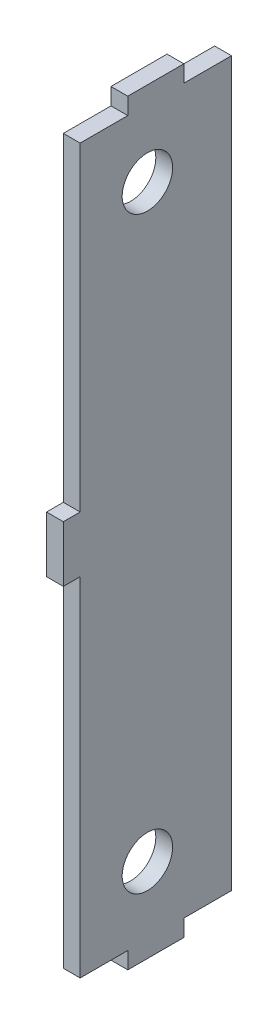
ISO-10303-21;
HEADER;
FILE_DESCRIPTION(('STEP AP214'),'2;1');
FILE_NAME('part.step','',(''),(''),'','','');
FILE_SCHEMA(('AUTOMOTIVE_DESIGN { 1 0 10303 214 1 1 1 1 }'));
ENDSEC;
DATA;
#1=APPLICATION_CONTEXT('core data for automotive mechanical design processes');
#2=APPLICATION_PROTOCOL_DEFINITION('international standard','automotive_design',2000,#1);
#3=PRODUCT_CONTEXT('',#1,'mechanical');
#4=PRODUCT('Part','Part','',(#3));
#5=PRODUCT_RELATED_PRODUCT_CATEGORY('part','',(#4));
#6=PRODUCT_DEFINITION_FORMATION('','',#4);
#7=PRODUCT_DEFINITION_CONTEXT('part definition',#1,'design');
#8=PRODUCT_DEFINITION('design','',#6,#7);
#9=PRODUCT_DEFINITION_SHAPE('','',#8);
#10=(LENGTH_UNIT() NAMED_UNIT(*) SI_UNIT(.MILLI.,.METRE.));
#11=(NAMED_UNIT(*) PLANE_ANGLE_UNIT() SI_UNIT($,.RADIAN.));
#12=(NAMED_UNIT(*) SI_UNIT($,.STERADIAN.) SOLID_ANGLE_UNIT());
#13=UNCERTAINTY_MEASURE_WITH_UNIT(LENGTH_MEASURE(1.E-05),#10,'distance_accuracy_value','');
#14=(GEOMETRIC_REPRESENTATION_CONTEXT(3) GLOBAL_UNCERTAINTY_ASSIGNED_CONTEXT((#13)) GLOBAL_UNIT_ASSIGNED_CONTEXT((#10,
#11,#12)) REPRESENTATION_CONTEXT('',''));
#15=CARTESIAN_POINT('',(0.,0.,0.));
#16=DIRECTION('',(0.,0.,1.));
#17=DIRECTION('',(1.,0.,0.));
#18=AXIS2_PLACEMENT_3D('',#15,#16,#17);
#19=CARTESIAN_POINT('',(3.,64.5,0.));
#20=DIRECTION('',(0.,0.,1.));
#21=DIRECTION('',(1.,0.,0.));
#22=AXIS2_PLACEMENT_3D('',#19,#20,#21);
#23=PLANE('',#22);
#24=DIRECTION('',(0.,1.,0.));
#25=VECTOR('',#24,1.);
#26=CARTESIAN_POINT('',(0.,64.5,0.));
#27=LINE('',#26,#25);
#28=CARTESIAN_POINT('',(0.,-64.5,0.));
#29=VERTEX_POINT('',#28);
#30=CARTESIAN_POINT('',(0.,64.5,0.));
#31=VERTEX_POINT('',#30);
#32=EDGE_CURVE('E177',#29,#31,#27,.T.);
#33=ORIENTED_EDGE('',*,*,#32,.T.);
#34=DIRECTION('',(-1.,0.,0.));
#35=VECTOR('',#34,1.);
#36=CARTESIAN_POINT('',(3.,64.5,0.));
#37=LINE('',#36,#35);
#38=CARTESIAN_POINT('',(3.,64.5,0.));
#39=VERTEX_POINT('',#38);
#40=EDGE_CURVE('E11',#39,#31,#37,.T.);
#41=ORIENTED_EDGE('',*,*,#40,.F.);
#42=DIRECTION('',(0.,1.,0.));
#43=VECTOR('',#42,1.);
#44=CARTESIAN_POINT('',(3.,64.5,0.));
#45=LINE('',#44,#43);
#46=CARTESIAN_POINT('',(3.,-64.5,0.));
#47=VERTEX_POINT('',#46);
#48=EDGE_CURVE('E208',#47,#39,#45,.T.);
#49=ORIENTED_EDGE('',*,*,#48,.F.);
#50=DIRECTION('',(-1.,0.,0.));
#51=VECTOR('',#50,1.);
#52=CARTESIAN_POINT('',(3.,-64.5,0.));
#53=LINE('',#52,#51);
#54=EDGE_CURVE('E173',#47,#29,#53,.T.);
#55=ORIENTED_EDGE('',*,*,#54,.T.);
#56=EDGE_LOOP('',(#33,#41,#49,#55));
#57=FACE_BOUND('',#56,.T.);
#58=ADVANCED_FACE('F33',(#57),#23,.F.);
#59=CARTESIAN_POINT('',(3.,64.5,0.));
#60=DIRECTION('',(0.,-1.,0.));
#61=DIRECTION('',(0.,0.,-1.));
#62=AXIS2_PLACEMENT_3D('',#59,#60,#61);
#63=PLANE('',#62);
#64=DIRECTION('',(0.,0.,1.));
#65=VECTOR('',#64,1.);
#66=CARTESIAN_POINT('',(0.,64.5,0.));
#67=LINE('',#66,#65);
#68=CARTESIAN_POINT('',(0.,64.5,8.49999999999999));
#69=VERTEX_POINT('',#68);
#70=EDGE_CURVE('E180',#31,#69,#67,.T.);
#71=ORIENTED_EDGE('',*,*,#70,.T.);
#72=DIRECTION('',(-1.,0.,0.));
#73=VECTOR('',#72,1.);
#74=CARTESIAN_POINT('',(3.,64.5,8.49999999999999));
#75=LINE('',#74,#73);
#76=CARTESIAN_POINT('',(3.,64.5,8.49999999999999));
#77=VERTEX_POINT('',#76);
#78=EDGE_CURVE('E41',#77,#69,#75,.T.);
#79=ORIENTED_EDGE('',*,*,#78,.F.);
#80=DIRECTION('',(0.,0.,1.));
#81=VECTOR('',#80,1.);
#82=CARTESIAN_POINT('',(3.,64.5,0.));
#83=LINE('',#82,#81);
#84=EDGE_CURVE('E116',#39,#77,#83,.T.);
#85=ORIENTED_EDGE('',*,*,#84,.F.);
#86=ORIENTED_EDGE('',*,*,#40,.T.);
#87=EDGE_LOOP('',(#71,#79,#85,#86));
#88=FACE_BOUND('',#87,.T.);
#89=ADVANCED_FACE('F307',(#88),#63,.F.);
#90=CARTESIAN_POINT('',(3.,64.5,8.49999999999999));
#91=DIRECTION('',(0.,0.,1.));
#92=DIRECTION('',(1.,0.,0.));
#93=AXIS2_PLACEMENT_3D('',#90,#91,#92);
#94=PLANE('',#93);
#95=DIRECTION('',(0.,1.,0.));
#96=VECTOR('',#95,1.);
#97=CARTESIAN_POINT('',(0.,64.5,8.49999999999999));
#98=LINE('',#97,#96);
#99=CARTESIAN_POINT('',(0.,67.5,8.49999999999999));
#100=VERTEX_POINT('',#99);
#101=EDGE_CURVE('E183',#69,#100,#98,.T.);
#102=ORIENTED_EDGE('',*,*,#101,.T.);
#103=DIRECTION('',(-1.,0.,0.));
#104=VECTOR('',#103,1.);
#105=CARTESIAN_POINT('',(3.,67.5,8.49999999999999));
#106=LINE('',#105,#104);
#107=CARTESIAN_POINT('',(3.,67.5,8.49999999999999));
#108=VERTEX_POINT('',#107);
#109=EDGE_CURVE('E239',#108,#100,#106,.T.);
#110=ORIENTED_EDGE('',*,*,#109,.F.);
#111=DIRECTION('',(0.,1.,0.));
#112=VECTOR('',#111,1.);
#113=CARTESIAN_POINT('',(3.,64.5,8.49999999999999));
#114=LINE('',#113,#112);
#115=EDGE_CURVE('E247',#77,#108,#114,.T.);
#116=ORIENTED_EDGE('',*,*,#115,.F.);
#117=ORIENTED_EDGE('',*,*,#78,.T.);
#118=EDGE_LOOP('',(#102,#110,#116,#117));
#119=FACE_BOUND('',#118,.T.);
#120=ADVANCED_FACE('F245',(#119),#94,.F.);
#121=CARTESIAN_POINT('',(3.,67.5,18.5));
#122=DIRECTION('',(0.,-1.,0.));
#123=DIRECTION('',(0.,0.,-1.));
#124=AXIS2_PLACEMENT_3D('',#121,#122,#123);
#125=PLANE('',#124);
#126=DIRECTION('',(0.,0.,1.));
#127=VECTOR('',#126,1.);
#128=CARTESIAN_POINT('',(0.,67.5,18.5));
#129=LINE('',#128,#127);
#130=CARTESIAN_POINT('',(0.,67.5,18.5));
#131=VERTEX_POINT('',#130);
#132=EDGE_CURVE('E185',#100,#131,#129,.T.);
#133=ORIENTED_EDGE('',*,*,#132,.T.);
#134=DIRECTION('',(-1.,0.,0.));
#135=VECTOR('',#134,1.);
#136=CARTESIAN_POINT('',(3.,67.5,18.5));
#137=LINE('',#136,#135);
#138=CARTESIAN_POINT('',(3.,67.5,18.5));
#139=VERTEX_POINT('',#138);
#140=EDGE_CURVE('E236',#139,#131,#137,.T.);
#141=ORIENTED_EDGE('',*,*,#140,.F.);
#142=DIRECTION('',(0.,0.,1.));
#143=VECTOR('',#142,1.);
#144=CARTESIAN_POINT('',(3.,67.5,18.5));
#145=LINE('',#144,#143);
#146=EDGE_CURVE('E265',#108,#139,#145,.T.);
#147=ORIENTED_EDGE('',*,*,#146,.F.);
#148=ORIENTED_EDGE('',*,*,#109,.T.);
#149=EDGE_LOOP('',(#133,#141,#147,#148));
#150=FACE_BOUND('',#149,.T.);
#151=ADVANCED_FACE('F256',(#150),#125,.F.);
#152=CARTESIAN_POINT('',(3.,64.5,18.5));
#153=DIRECTION('',(0.,0.,-1.));
#154=DIRECTION('',(-1.,0.,0.));
#155=AXIS2_PLACEMENT_3D('',#152,#153,#154);
#156=PLANE('',#155);
#157=DIRECTION('',(0.,-1.,0.));
#158=VECTOR('',#157,1.);
#159=CARTESIAN_POINT('',(0.,64.5,18.5));
#160=LINE('',#159,#158);
#161=CARTESIAN_POINT('',(0.,64.5,18.5));
#162=VERTEX_POINT('',#161);
#163=EDGE_CURVE('E187',#131,#162,#160,.T.);
#164=ORIENTED_EDGE('',*,*,#163,.T.);
#165=DIRECTION('',(-1.,0.,0.));
#166=VECTOR('',#165,1.);
#167=CARTESIAN_POINT('',(3.,64.5,18.5));
#168=LINE('',#167,#166);
#169=CARTESIAN_POINT('',(3.,64.5,18.5));
#170=VERTEX_POINT('',#169);
#171=EDGE_CURVE('E233',#170,#162,#168,.T.);
#172=ORIENTED_EDGE('',*,*,#171,.F.);
#173=DIRECTION('',(0.,-1.,0.));
#174=VECTOR('',#173,1.);
#175=CARTESIAN_POINT('',(3.,64.5,18.5));
#176=LINE('',#175,#174);
#177=EDGE_CURVE('E262',#139,#170,#176,.T.);
#178=ORIENTED_EDGE('',*,*,#177,.F.);
#179=ORIENTED_EDGE('',*,*,#140,.T.);
#180=EDGE_LOOP('',(#164,#172,#178,#179));
#181=FACE_BOUND('',#180,.T.);
#182=ADVANCED_FACE('F260',(#181),#156,.F.);
#183=CARTESIAN_POINT('',(3.,64.5,18.5));
#184=DIRECTION('',(0.,-1.,0.));
#185=DIRECTION('',(0.,0.,-1.));
#186=AXIS2_PLACEMENT_3D('',#183,#184,#185);
#187=PLANE('',#186);
#188=DIRECTION('',(0.,0.,1.));
#189=VECTOR('',#188,1.);
#190=CARTESIAN_POINT('',(0.,64.5,18.5));
#191=LINE('',#190,#189);
#192=CARTESIAN_POINT('',(0.,64.5,27.));
#193=VERTEX_POINT('',#192);
#194=EDGE_CURVE('E189',#162,#193,#191,.T.);
#195=ORIENTED_EDGE('',*,*,#194,.T.);
#196=DIRECTION('',(-1.,0.,0.));
#197=VECTOR('',#196,1.);
#198=CARTESIAN_POINT('',(3.,64.5,27.));
#199=LINE('',#198,#197);
#200=CARTESIAN_POINT('',(3.,64.5,27.));
#201=VERTEX_POINT('',#200);
#202=EDGE_CURVE('E230',#201,#193,#199,.T.);
#203=ORIENTED_EDGE('',*,*,#202,.F.);
#204=DIRECTION('',(0.,0.,1.));
#205=VECTOR('',#204,1.);
#206=CARTESIAN_POINT('',(3.,64.5,18.5));
#207=LINE('',#206,#205);
#208=EDGE_CURVE('E264',#170,#201,#207,.T.);
#209=ORIENTED_EDGE('',*,*,#208,.F.);
#210=ORIENTED_EDGE('',*,*,#171,.T.);
#211=EDGE_LOOP('',(#195,#203,#209,#210));
#212=FACE_BOUND('',#211,.T.);
#213=ADVANCED_FACE('F320',(#212),#187,.F.);
#214=CARTESIAN_POINT('',(3.,64.5,27.));
#215=DIRECTION('',(0.,0.,-1.));
#216=DIRECTION('',(0.,1.,0.));
#217=AXIS2_PLACEMENT_3D('',#214,#215,#216);
#218=PLANE('',#217);
#219=DIRECTION('',(0.,-1.,0.));
#220=VECTOR('',#219,1.);
#221=CARTESIAN_POINT('',(0.,64.5,27.));
#222=LINE('',#221,#220);
#223=CARTESIAN_POINT('',(0.,7.5,27.));
#224=VERTEX_POINT('',#223);
#225=EDGE_CURVE('E191',#193,#224,#222,.T.);
#226=ORIENTED_EDGE('',*,*,#225,.T.);
#227=DIRECTION('',(-1.,0.,0.));
#228=VECTOR('',#227,1.);
#229=CARTESIAN_POINT('',(3.,7.5,27.));
#230=LINE('',#229,#228);
#231=CARTESIAN_POINT('',(3.,7.5,27.));
#232=VERTEX_POINT('',#231);
#233=EDGE_CURVE('E227',#232,#224,#230,.T.);
#234=ORIENTED_EDGE('',*,*,#233,.F.);
#235=DIRECTION('',(0.,-1.,0.));
#236=VECTOR('',#235,1.);
#237=CARTESIAN_POINT('',(3.,64.5,27.));
#238=LINE('',#237,#236);
#239=EDGE_CURVE('E267',#201,#232,#238,.T.);
#240=ORIENTED_EDGE('',*,*,#239,.F.);
#241=ORIENTED_EDGE('',*,*,#202,.T.);
#242=EDGE_LOOP('',(#226,#234,#240,#241));
#243=FACE_BOUND('',#242,.T.);
#244=ADVANCED_FACE('F323',(#243),#218,.F.);
#245=CARTESIAN_POINT('',(3.,7.5,27.));
#246=DIRECTION('',(0.,-1.,0.));
#247=DIRECTION('',(0.,0.,-1.));
#248=AXIS2_PLACEMENT_3D('',#245,#246,#247);
#249=PLANE('',#248);
#250=DIRECTION('',(0.,0.,1.));
#251=VECTOR('',#250,1.);
#252=CARTESIAN_POINT('',(0.,7.5,27.));
#253=LINE('',#252,#251);
#254=CARTESIAN_POINT('',(0.,7.5,30.));
#255=VERTEX_POINT('',#254);
#256=EDGE_CURVE('E193',#224,#255,#253,.T.);
#257=ORIENTED_EDGE('',*,*,#256,.T.);
#258=DIRECTION('',(-1.,0.,0.));
#259=VECTOR('',#258,1.);
#260=CARTESIAN_POINT('',(3.,7.5,30.));
#261=LINE('',#260,#259);
#262=CARTESIAN_POINT('',(3.,7.5,30.));
#263=VERTEX_POINT('',#262);
#264=EDGE_CURVE('E224',#263,#255,#261,.T.);
#265=ORIENTED_EDGE('',*,*,#264,.F.);
#266=DIRECTION('',(0.,0.,1.));
#267=VECTOR('',#266,1.);
#268=CARTESIAN_POINT('',(3.,7.5,27.));
#269=LINE('',#268,#267);
#270=EDGE_CURVE('E273',#232,#263,#269,.T.);
#271=ORIENTED_EDGE('',*,*,#270,.F.);
#272=ORIENTED_EDGE('',*,*,#233,.T.);
#273=EDGE_LOOP('',(#257,#265,#271,#272));
#274=FACE_BOUND('',#273,.T.);
#275=ADVANCED_FACE('F327',(#274),#249,.F.);
#276=CARTESIAN_POINT('',(3.,7.5,30.));
#277=DIRECTION('',(0.,0.,-1.));
#278=DIRECTION('',(0.,1.,0.));
#279=AXIS2_PLACEMENT_3D('',#276,#277,#278);
#280=PLANE('',#279);
#281=DIRECTION('',(0.,-1.,0.));
#282=VECTOR('',#281,1.);
#283=CARTESIAN_POINT('',(0.,7.5,30.));
#284=LINE('',#283,#282);
#285=CARTESIAN_POINT('',(0.,-2.5,30.));
#286=VERTEX_POINT('',#285);
#287=EDGE_CURVE('E195',#255,#286,#284,.T.);
#288=ORIENTED_EDGE('',*,*,#287,.T.);
#289=DIRECTION('',(-1.,0.,0.));
#290=VECTOR('',#289,1.);
#291=CARTESIAN_POINT('',(3.,-2.5,30.));
#292=LINE('',#291,#290);
#293=CARTESIAN_POINT('',(3.,-2.5,30.));
#294=VERTEX_POINT('',#293);
#295=EDGE_CURVE('E221',#294,#286,#292,.T.);
#296=ORIENTED_EDGE('',*,*,#295,.F.);
#297=DIRECTION('',(0.,-1.,0.));
#298=VECTOR('',#297,1.);
#299=CARTESIAN_POINT('',(3.,7.5,30.));
#300=LINE('',#299,#298);
#301=EDGE_CURVE('E275',#263,#294,#300,.T.);
#302=ORIENTED_EDGE('',*,*,#301,.F.);
#303=ORIENTED_EDGE('',*,*,#264,.T.);
#304=EDGE_LOOP('',(#288,#296,#302,#303));
#305=FACE_BOUND('',#304,.T.);
#306=ADVANCED_FACE('F331',(#305),#280,.F.);
#307=CARTESIAN_POINT('',(3.,-2.5,27.));
#308=DIRECTION('',(0.,1.,0.));
#309=DIRECTION('',(0.,0.,1.));
#310=AXIS2_PLACEMENT_3D('',#307,#308,#309);
#311=PLANE('',#310);
#312=DIRECTION('',(0.,0.,-1.));
#313=VECTOR('',#312,1.);
#314=CARTESIAN_POINT('',(0.,-2.5,27.));
#315=LINE('',#314,#313);
#316=CARTESIAN_POINT('',(0.,-2.5,27.));
#317=VERTEX_POINT('',#316);
#318=EDGE_CURVE('E197',#286,#317,#315,.T.);
#319=ORIENTED_EDGE('',*,*,#318,.T.);
#320=DIRECTION('',(-1.,0.,0.));
#321=VECTOR('',#320,1.);
#322=CARTESIAN_POINT('',(3.,-2.5,27.));
#323=LINE('',#322,#321);
#324=CARTESIAN_POINT('',(3.,-2.5,27.));
#325=VERTEX_POINT('',#324);
#326=EDGE_CURVE('E218',#325,#317,#323,.T.);
#327=ORIENTED_EDGE('',*,*,#326,.F.);
#328=DIRECTION('',(0.,0.,-1.));
#329=VECTOR('',#328,1.);
#330=CARTESIAN_POINT('',(3.,-2.5,27.));
#331=LINE('',#330,#329);
#332=EDGE_CURVE('E277',#294,#325,#331,.T.);
#333=ORIENTED_EDGE('',*,*,#332,.F.);
#334=ORIENTED_EDGE('',*,*,#295,.T.);
#335=EDGE_LOOP('',(#319,#327,#333,#334));
#336=FACE_BOUND('',#335,.T.);
#337=ADVANCED_FACE('F335',(#336),#311,.F.);
#338=CARTESIAN_POINT('',(3.,-2.5,27.));
#339=DIRECTION('',(0.,0.,-1.));
#340=DIRECTION('',(0.,1.,0.));
#341=AXIS2_PLACEMENT_3D('',#338,#339,#340);
#342=PLANE('',#341);
#343=DIRECTION('',(0.,-1.,0.));
#344=VECTOR('',#343,1.);
#345=CARTESIAN_POINT('',(0.,-2.5,27.));
#346=LINE('',#345,#344);
#347=CARTESIAN_POINT('',(0.,-64.5,27.));
#348=VERTEX_POINT('',#347);
#349=EDGE_CURVE('E199',#317,#348,#346,.T.);
#350=ORIENTED_EDGE('',*,*,#349,.T.);
#351=DIRECTION('',(-1.,0.,0.));
#352=VECTOR('',#351,1.);
#353=CARTESIAN_POINT('',(3.,-64.5,27.));
#354=LINE('',#353,#352);
#355=CARTESIAN_POINT('',(3.,-64.5,27.));
#356=VERTEX_POINT('',#355);
#357=EDGE_CURVE('E215',#356,#348,#354,.T.);
#358=ORIENTED_EDGE('',*,*,#357,.F.);
#359=DIRECTION('',(0.,-1.,0.));
#360=VECTOR('',#359,1.);
#361=CARTESIAN_POINT('',(3.,-2.5,27.));
#362=LINE('',#361,#360);
#363=EDGE_CURVE('E279',#325,#356,#362,.T.);
#364=ORIENTED_EDGE('',*,*,#363,.F.);
#365=ORIENTED_EDGE('',*,*,#326,.T.);
#366=EDGE_LOOP('',(#350,#358,#364,#365));
#367=FACE_BOUND('',#366,.T.);
#368=ADVANCED_FACE('F339',(#367),#342,.F.);
#369=CARTESIAN_POINT('',(3.,-64.5,18.5));
#370=DIRECTION('',(0.,1.,0.));
#371=DIRECTION('',(0.,0.,1.));
#372=AXIS2_PLACEMENT_3D('',#369,#370,#371);
#373=PLANE('',#372);
#374=DIRECTION('',(0.,0.,-1.));
#375=VECTOR('',#374,1.);
#376=CARTESIAN_POINT('',(0.,-64.5,18.5));
#377=LINE('',#376,#375);
#378=CARTESIAN_POINT('',(0.,-64.5,18.5));
#379=VERTEX_POINT('',#378);
#380=EDGE_CURVE('E201',#348,#379,#377,.T.);
#381=ORIENTED_EDGE('',*,*,#380,.T.);
#382=DIRECTION('',(-1.,0.,0.));
#383=VECTOR('',#382,1.);
#384=CARTESIAN_POINT('',(3.,-64.5,18.5));
#385=LINE('',#384,#383);
#386=CARTESIAN_POINT('',(3.,-64.5,18.5));
#387=VERTEX_POINT('',#386);
#388=EDGE_CURVE('E212',#387,#379,#385,.T.);
#389=ORIENTED_EDGE('',*,*,#388,.F.);
#390=DIRECTION('',(0.,0.,-1.));
#391=VECTOR('',#390,1.);
#392=CARTESIAN_POINT('',(3.,-64.5,18.5));
#393=LINE('',#392,#391);
#394=EDGE_CURVE('E281',#356,#387,#393,.T.);
#395=ORIENTED_EDGE('',*,*,#394,.F.);
#396=ORIENTED_EDGE('',*,*,#357,.T.);
#397=EDGE_LOOP('',(#381,#389,#395,#396));
#398=FACE_BOUND('',#397,.T.);
#399=ADVANCED_FACE('F287',(#398),#373,.F.);
#400=CARTESIAN_POINT('',(3.,-64.5,18.5));
#401=DIRECTION('',(0.,0.,-1.));
#402=DIRECTION('',(0.,1.,0.));
#403=AXIS2_PLACEMENT_3D('',#400,#401,#402);
#404=PLANE('',#403);
#405=DIRECTION('',(0.,-1.,0.));
#406=VECTOR('',#405,1.);
#407=CARTESIAN_POINT('',(0.,-64.5,18.5));
#408=LINE('',#407,#406);
#409=CARTESIAN_POINT('',(0.,-67.5,18.5));
#410=VERTEX_POINT('',#409);
#411=EDGE_CURVE('E203',#379,#410,#408,.T.);
#412=ORIENTED_EDGE('',*,*,#411,.T.);
#413=DIRECTION('',(-1.,0.,0.));
#414=VECTOR('',#413,1.);
#415=CARTESIAN_POINT('',(3.,-67.5,18.5));
#416=LINE('',#415,#414);
#417=CARTESIAN_POINT('',(3.,-67.5,18.5));
#418=VERTEX_POINT('',#417);
#419=EDGE_CURVE('E168',#418,#410,#416,.T.);
#420=ORIENTED_EDGE('',*,*,#419,.F.);
#421=DIRECTION('',(0.,-1.,0.));
#422=VECTOR('',#421,1.);
#423=CARTESIAN_POINT('',(3.,-64.5,18.5));
#424=LINE('',#423,#422);
#425=EDGE_CURVE('E159',#387,#418,#424,.T.);
#426=ORIENTED_EDGE('',*,*,#425,.F.);
#427=ORIENTED_EDGE('',*,*,#388,.T.);
#428=EDGE_LOOP('',(#412,#420,#426,#427));
#429=FACE_BOUND('',#428,.T.);
#430=ADVANCED_FACE('F291',(#429),#404,.F.);
#431=CARTESIAN_POINT('',(3.,-67.5,18.5));
#432=DIRECTION('',(0.,1.,0.));
#433=DIRECTION('',(0.,0.,1.));
#434=AXIS2_PLACEMENT_3D('',#431,#432,#433);
#435=PLANE('',#434);
#436=DIRECTION('',(0.,0.,-1.));
#437=VECTOR('',#436,1.);
#438=CARTESIAN_POINT('',(0.,-67.5,18.5));
#439=LINE('',#438,#437);
#440=CARTESIAN_POINT('',(0.,-67.5,8.49999999999998));
#441=VERTEX_POINT('',#440);
#442=EDGE_CURVE('E167',#410,#441,#439,.T.);
#443=ORIENTED_EDGE('',*,*,#442,.T.);
#444=DIRECTION('',(-1.,0.,0.));
#445=VECTOR('',#444,1.);
#446=CARTESIAN_POINT('',(3.,-67.5,8.49999999999998));
#447=LINE('',#446,#445);
#448=CARTESIAN_POINT('',(3.,-67.5,8.49999999999998));
#449=VERTEX_POINT('',#448);
#450=EDGE_CURVE('E164',#449,#441,#447,.T.);
#451=ORIENTED_EDGE('',*,*,#450,.F.);
#452=DIRECTION('',(0.,0.,-1.));
#453=VECTOR('',#452,1.);
#454=CARTESIAN_POINT('',(3.,-67.5,18.5));
#455=LINE('',#454,#453);
#456=EDGE_CURVE('E153',#418,#449,#455,.T.);
#457=ORIENTED_EDGE('',*,*,#456,.F.);
#458=ORIENTED_EDGE('',*,*,#419,.T.);
#459=EDGE_LOOP('',(#443,#451,#457,#458));
#460=FACE_BOUND('',#459,.T.);
#461=ADVANCED_FACE('F165',(#460),#435,.F.);
#462=CARTESIAN_POINT('',(3.,-64.5,8.49999999999999));
#463=DIRECTION('',(0.,0.,1.));
#464=DIRECTION('',(0.,-1.,0.));
#465=AXIS2_PLACEMENT_3D('',#462,#463,#464);
#466=PLANE('',#465);
#467=DIRECTION('',(0.,1.,0.));
#468=VECTOR('',#467,1.);
#469=CARTESIAN_POINT('',(0.,-64.5,8.49999999999999));
#470=LINE('',#469,#468);
#471=CARTESIAN_POINT('',(0.,-64.5,8.49999999999999));
#472=VERTEX_POINT('',#471);
#473=EDGE_CURVE('E102',#441,#472,#470,.T.);
#474=ORIENTED_EDGE('',*,*,#473,.T.);
#475=DIRECTION('',(-1.,0.,0.));
#476=VECTOR('',#475,1.);
#477=CARTESIAN_POINT('',(3.,-64.5,8.49999999999999));
#478=LINE('',#477,#476);
#479=CARTESIAN_POINT('',(3.,-64.5,8.49999999999999));
#480=VERTEX_POINT('',#479);
#481=EDGE_CURVE('E169',#480,#472,#478,.T.);
#482=ORIENTED_EDGE('',*,*,#481,.F.);
#483=DIRECTION('',(0.,1.,0.));
#484=VECTOR('',#483,1.);
#485=CARTESIAN_POINT('',(3.,-64.5,8.49999999999999));
#486=LINE('',#485,#484);
#487=EDGE_CURVE('E157',#449,#480,#486,.T.);
#488=ORIENTED_EDGE('',*,*,#487,.F.);
#489=ORIENTED_EDGE('',*,*,#450,.T.);
#490=EDGE_LOOP('',(#474,#482,#488,#489));
#491=FACE_BOUND('',#490,.T.);
#492=ADVANCED_FACE('F171',(#491),#466,.F.);
#493=CARTESIAN_POINT('',(3.,-64.5,0.));
#494=DIRECTION('',(0.,1.,0.));
#495=DIRECTION('',(0.,0.,1.));
#496=AXIS2_PLACEMENT_3D('',#493,#494,#495);
#497=PLANE('',#496);
#498=DIRECTION('',(0.,0.,-1.));
#499=VECTOR('',#498,1.);
#500=CARTESIAN_POINT('',(0.,-64.5,0.));
#501=LINE('',#500,#499);
#502=EDGE_CURVE('E108',#472,#29,#501,.T.);
#503=ORIENTED_EDGE('',*,*,#502,.T.);
#504=ORIENTED_EDGE('',*,*,#54,.F.);
#505=DIRECTION('',(0.,0.,-1.));
#506=VECTOR('',#505,1.);
#507=CARTESIAN_POINT('',(3.,-64.5,0.));
#508=LINE('',#507,#506);
#509=EDGE_CURVE('E49',#480,#47,#508,.T.);
#510=ORIENTED_EDGE('',*,*,#509,.F.);
#511=ORIENTED_EDGE('',*,*,#481,.T.);
#512=EDGE_LOOP('',(#503,#504,#510,#511));
#513=FACE_BOUND('',#512,.T.);
#514=ADVANCED_FACE('F295',(#513),#497,.F.);
#515=CARTESIAN_POINT('',(3.,0.,0.));
#516=DIRECTION('',(-1.,0.,0.));
#517=DIRECTION('',(0.,0.,1.));
#518=AXIS2_PLACEMENT_3D('',#515,#516,#517);
#519=PLANE('',#518);
#520=CARTESIAN_POINT('',(3.,52.5,15.));
#521=DIRECTION('',(1.,0.,0.));
#522=DIRECTION('',(0.,0.,-1.));
#523=AXIS2_PLACEMENT_3D('',#520,#521,#522);
#524=CIRCLE('',#523,4.50000000000001);
#525=CARTESIAN_POINT('',(3.,52.5,10.5));
#526=VERTEX_POINT('',#525);
#527=EDGE_CURVE('E404',#526,#526,#524,.T.);
#528=ORIENTED_EDGE('',*,*,#527,.F.);
#529=EDGE_LOOP('',(#528));
#530=FACE_BOUND('',#529,.T.);
#531=CARTESIAN_POINT('',(3.,-52.5,15.));
#532=DIRECTION('',(1.,0.,0.));
#533=DIRECTION('',(0.,0.,-1.));
#534=AXIS2_PLACEMENT_3D('',#531,#532,#533);
#535=CIRCLE('',#534,4.50000000000001);
#536=CARTESIAN_POINT('',(3.,-52.5,10.5));
#537=VERTEX_POINT('',#536);
#538=EDGE_CURVE('E409',#537,#537,#535,.T.);
#539=ORIENTED_EDGE('',*,*,#538,.F.);
#540=EDGE_LOOP('',(#539));
#541=FACE_BOUND('',#540,.T.);
#542=ORIENTED_EDGE('',*,*,#48,.T.);
#543=ORIENTED_EDGE('',*,*,#84,.T.);
#544=ORIENTED_EDGE('',*,*,#115,.T.);
#545=ORIENTED_EDGE('',*,*,#146,.T.);
#546=ORIENTED_EDGE('',*,*,#177,.T.);
#547=ORIENTED_EDGE('',*,*,#208,.T.);
#548=ORIENTED_EDGE('',*,*,#239,.T.);
#549=ORIENTED_EDGE('',*,*,#270,.T.);
#550=ORIENTED_EDGE('',*,*,#301,.T.);
#551=ORIENTED_EDGE('',*,*,#332,.T.);
#552=ORIENTED_EDGE('',*,*,#363,.T.);
#553=ORIENTED_EDGE('',*,*,#394,.T.);
#554=ORIENTED_EDGE('',*,*,#425,.T.);
#555=ORIENTED_EDGE('',*,*,#456,.T.);
#556=ORIENTED_EDGE('',*,*,#487,.T.);
#557=ORIENTED_EDGE('',*,*,#509,.T.);
#558=EDGE_LOOP('',(#542,#543,#544,#545,#546,#547,#548,#549,#550,#551,#552,#553,#554,#555,#556,#557));
#559=FACE_BOUND('',#558,.T.);
#560=ADVANCED_FACE('F155',(#530,#541,#559),#519,.F.);
#561=CARTESIAN_POINT('',(0.,0.,0.));
#562=DIRECTION('',(-1.,0.,0.));
#563=DIRECTION('',(0.,0.,1.));
#564=AXIS2_PLACEMENT_3D('',#561,#562,#563);
#565=PLANE('',#564);
#566=CARTESIAN_POINT('',(0.,52.5,15.));
#567=DIRECTION('',(1.,0.,0.));
#568=DIRECTION('',(0.,0.,-1.));
#569=AXIS2_PLACEMENT_3D('',#566,#567,#568);
#570=CIRCLE('',#569,4.50000000000001);
#571=CARTESIAN_POINT('',(0.,52.5,10.5));
#572=VERTEX_POINT('',#571);
#573=EDGE_CURVE('E181',#572,#572,#570,.T.);
#574=ORIENTED_EDGE('',*,*,#573,.T.);
#575=EDGE_LOOP('',(#574));
#576=FACE_BOUND('',#575,.T.);
#577=CARTESIAN_POINT('',(0.,-52.5,15.));
#578=DIRECTION('',(1.,0.,0.));
#579=DIRECTION('',(0.,0.,-1.));
#580=AXIS2_PLACEMENT_3D('',#577,#578,#579);
#581=CIRCLE('',#580,4.50000000000001);
#582=CARTESIAN_POINT('',(0.,-52.5,10.5));
#583=VERTEX_POINT('',#582);
#584=EDGE_CURVE('E405',#583,#583,#581,.T.);
#585=ORIENTED_EDGE('',*,*,#584,.T.);
#586=EDGE_LOOP('',(#585));
#587=FACE_BOUND('',#586,.T.);
#588=ORIENTED_EDGE('',*,*,#32,.F.);
#589=ORIENTED_EDGE('',*,*,#502,.F.);
#590=ORIENTED_EDGE('',*,*,#473,.F.);
#591=ORIENTED_EDGE('',*,*,#442,.F.);
#592=ORIENTED_EDGE('',*,*,#411,.F.);
#593=ORIENTED_EDGE('',*,*,#380,.F.);
#594=ORIENTED_EDGE('',*,*,#349,.F.);
#595=ORIENTED_EDGE('',*,*,#318,.F.);
#596=ORIENTED_EDGE('',*,*,#287,.F.);
#597=ORIENTED_EDGE('',*,*,#256,.F.);
#598=ORIENTED_EDGE('',*,*,#225,.F.);
#599=ORIENTED_EDGE('',*,*,#194,.F.);
#600=ORIENTED_EDGE('',*,*,#163,.F.);
#601=ORIENTED_EDGE('',*,*,#132,.F.);
#602=ORIENTED_EDGE('',*,*,#101,.F.);
#603=ORIENTED_EDGE('',*,*,#70,.F.);
#604=EDGE_LOOP('',(#588,#589,#590,#591,#592,#593,#594,#595,#596,#597,#598,#599,#600,#601,#602,#603));
#605=FACE_BOUND('',#604,.T.);
#606=ADVANCED_FACE('F251',(#576,#587,#605),#565,.T.);
#607=CARTESIAN_POINT('',(0.,-52.5,15.));
#608=DIRECTION('',(1.,0.,0.));
#609=DIRECTION('',(0.,0.,-1.));
#610=AXIS2_PLACEMENT_3D('',#607,#608,#609);
#611=CYLINDRICAL_SURFACE('',#610,4.50000000000001);
#612=ORIENTED_EDGE('',*,*,#584,.F.);
#613=EDGE_LOOP('',(#612));
#614=FACE_BOUND('',#613,.T.);
#615=ORIENTED_EDGE('',*,*,#538,.T.);
#616=EDGE_LOOP('',(#615));
#617=FACE_BOUND('',#616,.T.);
#618=ADVANCED_FACE('F376',(#614,#617),#611,.F.);
#619=CARTESIAN_POINT('',(0.,52.5,15.));
#620=DIRECTION('',(1.,0.,0.));
#621=DIRECTION('',(0.,0.,-1.));
#622=AXIS2_PLACEMENT_3D('',#619,#620,#621);
#623=CYLINDRICAL_SURFACE('',#622,4.50000000000001);
#624=ORIENTED_EDGE('',*,*,#573,.F.);
#625=EDGE_LOOP('',(#624));
#626=FACE_BOUND('',#625,.T.);
#627=ORIENTED_EDGE('',*,*,#527,.T.);
#628=EDGE_LOOP('',(#627));
#629=FACE_BOUND('',#628,.T.);
#630=ADVANCED_FACE('F385',(#626,#629),#623,.F.);
#631=CLOSED_SHELL('',(#58,#89,#120,#151,#182,#213,#244,#275,#306,#337,#368,#399,#430,#461,#492,
#514,#560,#606,#618,#630));
#632=MANIFOLD_SOLID_BREP('B2',#631);
#633=ADVANCED_BREP_SHAPE_REPRESENTATION('',(#18,#632),#14);
#634=SHAPE_DEFINITION_REPRESENTATION(#9,#633);
ENDSEC;
END-ISO-10303-21;
